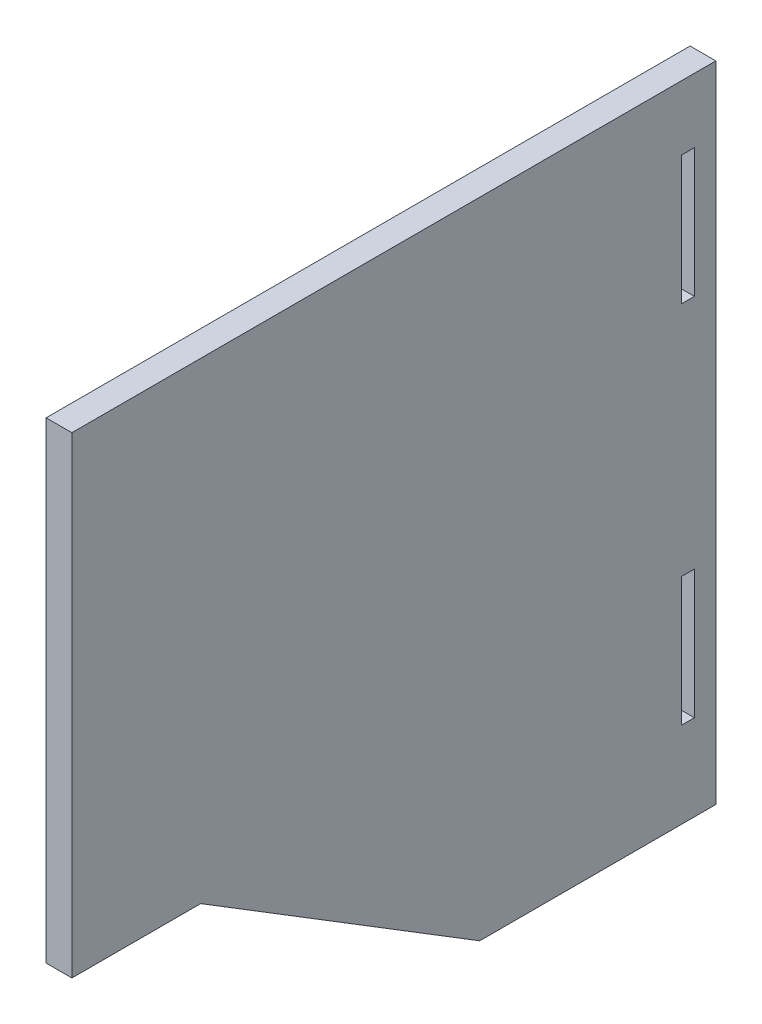
ISO-10303-21;
HEADER;
FILE_DESCRIPTION(('STEP AP214'),'2;1');
FILE_NAME('part.step','',(''),(''),'','','');
FILE_SCHEMA(('AUTOMOTIVE_DESIGN { 1 0 10303 214 1 1 1 1 }'));
ENDSEC;
DATA;
#1=APPLICATION_CONTEXT('core data for automotive mechanical design processes');
#2=APPLICATION_PROTOCOL_DEFINITION('international standard','automotive_design',2000,#1);
#3=PRODUCT_CONTEXT('',#1,'mechanical');
#4=PRODUCT('Part','Part','',(#3));
#5=PRODUCT_RELATED_PRODUCT_CATEGORY('part','',(#4));
#6=PRODUCT_DEFINITION_FORMATION('','',#4);
#7=PRODUCT_DEFINITION_CONTEXT('part definition',#1,'design');
#8=PRODUCT_DEFINITION('design','',#6,#7);
#9=PRODUCT_DEFINITION_SHAPE('','',#8);
#10=(LENGTH_UNIT() NAMED_UNIT(*) SI_UNIT(.MILLI.,.METRE.));
#11=(NAMED_UNIT(*) PLANE_ANGLE_UNIT() SI_UNIT($,.RADIAN.));
#12=(NAMED_UNIT(*) SI_UNIT($,.STERADIAN.) SOLID_ANGLE_UNIT());
#13=UNCERTAINTY_MEASURE_WITH_UNIT(LENGTH_MEASURE(1.E-05),#10,'distance_accuracy_value','');
#14=(GEOMETRIC_REPRESENTATION_CONTEXT(3) GLOBAL_UNCERTAINTY_ASSIGNED_CONTEXT((#13)) GLOBAL_UNIT_ASSIGNED_CONTEXT((#10,
#11,#12)) REPRESENTATION_CONTEXT('',''));
#15=CARTESIAN_POINT('',(0.,0.,0.));
#16=DIRECTION('',(0.,0.,1.));
#17=DIRECTION('',(1.,0.,0.));
#18=AXIS2_PLACEMENT_3D('',#15,#16,#17);
#19=CARTESIAN_POINT('',(-50.,150.,-70.));
#20=DIRECTION('',(0.,0.,1.));
#21=DIRECTION('',(1.,0.,0.));
#22=AXIS2_PLACEMENT_3D('',#19,#20,#21);
#23=PLANE('',#22);
#24=DIRECTION('',(0.,-1.,0.));
#25=VECTOR('',#24,1.);
#26=CARTESIAN_POINT('',(-45.,150.,-70.));
#27=LINE('',#26,#25);
#28=CARTESIAN_POINT('',(-45.,135.,-70.));
#29=VERTEX_POINT('',#28);
#30=CARTESIAN_POINT('',(-45.,105.,-70.));
#31=VERTEX_POINT('',#30);
#32=EDGE_CURVE('E258',#29,#31,#27,.T.);
#33=ORIENTED_EDGE('',*,*,#32,.F.);
#34=DIRECTION('',(1.,0.,0.));
#35=VECTOR('',#34,1.);
#36=CARTESIAN_POINT('',(-51.,135.,-70.));
#37=LINE('',#36,#35);
#38=CARTESIAN_POINT('',(-51.,135.,-70.));
#39=VERTEX_POINT('',#38);
#40=EDGE_CURVE('E236',#39,#29,#37,.T.);
#41=ORIENTED_EDGE('',*,*,#40,.F.);
#42=DIRECTION('',(0.,1.,0.));
#43=VECTOR('',#42,1.);
#44=CARTESIAN_POINT('',(-51.,135.,-70.));
#45=LINE('',#44,#43);
#46=CARTESIAN_POINT('',(-51.,105.,-70.));
#47=VERTEX_POINT('',#46);
#48=EDGE_CURVE('E225',#47,#39,#45,.T.);
#49=ORIENTED_EDGE('',*,*,#48,.F.);
#50=DIRECTION('',(1.,0.,0.));
#51=VECTOR('',#50,1.);
#52=CARTESIAN_POINT('',(-51.,105.,-70.));
#53=LINE('',#52,#51);
#54=EDGE_CURVE('E212',#47,#31,#53,.T.);
#55=ORIENTED_EDGE('',*,*,#54,.T.);
#56=EDGE_LOOP('',(#33,#41,#49,#55));
#57=FACE_BOUND('',#56,.T.);
#58=ADVANCED_FACE('F39',(#57),#23,.T.);
#59=CARTESIAN_POINT('',(-50.,150.,-75.));
#60=DIRECTION('',(0.,0.,1.));
#61=DIRECTION('',(1.,0.,0.));
#62=AXIS2_PLACEMENT_3D('',#59,#60,#61);
#63=PLANE('',#62);
#64=DIRECTION('',(-1.,0.,0.));
#65=VECTOR('',#64,1.);
#66=CARTESIAN_POINT('',(-50.,150.,-75.));
#67=LINE('',#66,#65);
#68=CARTESIAN_POINT('',(-45.,150.,-75.));
#69=VERTEX_POINT('',#68);
#70=CARTESIAN_POINT('',(-51.,150.,-75.));
#71=VERTEX_POINT('',#70);
#72=EDGE_CURVE('E48',#69,#71,#67,.T.);
#73=ORIENTED_EDGE('',*,*,#72,.F.);
#74=DIRECTION('',(0.,1.,0.));
#75=VECTOR('',#74,1.);
#76=CARTESIAN_POINT('',(-45.,0.,-75.));
#77=LINE('',#76,#75);
#78=CARTESIAN_POINT('',(-45.,0.,-75.));
#79=VERTEX_POINT('',#78);
#80=EDGE_CURVE('E146',#79,#69,#77,.T.);
#81=ORIENTED_EDGE('',*,*,#80,.F.);
#82=DIRECTION('',(-1.,0.,0.));
#83=VECTOR('',#82,1.);
#84=CARTESIAN_POINT('',(-50.,0.,-75.));
#85=LINE('',#84,#83);
#86=CARTESIAN_POINT('',(-51.,0.,-75.));
#87=VERTEX_POINT('',#86);
#88=EDGE_CURVE('E43',#79,#87,#85,.T.);
#89=ORIENTED_EDGE('',*,*,#88,.T.);
#90=DIRECTION('',(0.,-1.,0.));
#91=VECTOR('',#90,1.);
#92=CARTESIAN_POINT('',(-51.,150.,-75.));
#93=LINE('',#92,#91);
#94=EDGE_CURVE('E196',#71,#87,#93,.T.);
#95=ORIENTED_EDGE('',*,*,#94,.F.);
#96=EDGE_LOOP('',(#73,#81,#89,#95));
#97=FACE_BOUND('',#96,.T.);
#98=ADVANCED_FACE('F41',(#97),#63,.F.);
#99=CARTESIAN_POINT('',(-45.,150.,75.));
#100=DIRECTION('',(1.,0.,0.));
#101=DIRECTION('',(0.,0.,-1.));
#102=AXIS2_PLACEMENT_3D('',#99,#100,#101);
#103=PLANE('',#102);
#104=DIRECTION('',(0.,0.,1.));
#105=VECTOR('',#104,1.);
#106=CARTESIAN_POINT('',(-45.,135.,75.));
#107=LINE('',#106,#105);
#108=CARTESIAN_POINT('',(-45.,135.,-67.));
#109=VERTEX_POINT('',#108);
#110=EDGE_CURVE('E203',#29,#109,#107,.T.);
#111=ORIENTED_EDGE('',*,*,#110,.F.);
#112=ORIENTED_EDGE('',*,*,#32,.T.);
#113=DIRECTION('',(0.,0.,-1.));
#114=VECTOR('',#113,1.);
#115=CARTESIAN_POINT('',(-45.,105.,75.));
#116=LINE('',#115,#114);
#117=CARTESIAN_POINT('',(-45.,105.,-67.));
#118=VERTEX_POINT('',#117);
#119=EDGE_CURVE('E198',#118,#31,#116,.T.);
#120=ORIENTED_EDGE('',*,*,#119,.F.);
#121=DIRECTION('',(0.,-1.,0.));
#122=VECTOR('',#121,1.);
#123=CARTESIAN_POINT('',(-45.,150.,-67.));
#124=LINE('',#123,#122);
#125=EDGE_CURVE('E201',#109,#118,#124,.T.);
#126=ORIENTED_EDGE('',*,*,#125,.F.);
#127=EDGE_LOOP('',(#111,#112,#120,#126));
#128=FACE_BOUND('',#127,.T.);
#129=DIRECTION('',(0.,0.,1.));
#130=VECTOR('',#129,1.);
#131=CARTESIAN_POINT('',(-45.,50.,75.));
#132=LINE('',#131,#130);
#133=CARTESIAN_POINT('',(-45.,50.,-70.));
#134=VERTEX_POINT('',#133);
#135=CARTESIAN_POINT('',(-45.,50.,-67.));
#136=VERTEX_POINT('',#135);
#137=EDGE_CURVE('E210',#134,#136,#132,.T.);
#138=ORIENTED_EDGE('',*,*,#137,.F.);
#139=CARTESIAN_POINT('',(-45.,20.,-70.));
#140=VERTEX_POINT('',#139);
#141=EDGE_CURVE('E158',#134,#140,#27,.T.);
#142=ORIENTED_EDGE('',*,*,#141,.T.);
#143=DIRECTION('',(0.,0.,-1.));
#144=VECTOR('',#143,1.);
#145=CARTESIAN_POINT('',(-45.,20.0000000000003,75.0000000000003));
#146=LINE('',#145,#144);
#147=CARTESIAN_POINT('',(-45.,20.,-67.));
#148=VERTEX_POINT('',#147);
#149=EDGE_CURVE('E205',#148,#140,#146,.T.);
#150=ORIENTED_EDGE('',*,*,#149,.F.);
#151=DIRECTION('',(0.,-1.,0.));
#152=VECTOR('',#151,1.);
#153=CARTESIAN_POINT('',(-45.,150.,-67.));
#154=LINE('',#153,#152);
#155=EDGE_CURVE('E208',#136,#148,#154,.T.);
#156=ORIENTED_EDGE('',*,*,#155,.F.);
#157=EDGE_LOOP('',(#138,#142,#150,#156));
#158=FACE_BOUND('',#157,.T.);
#159=DIRECTION('',(0.,0.,1.));
#160=VECTOR('',#159,1.);
#161=CARTESIAN_POINT('',(-45.,150.,0.));
#162=LINE('',#161,#160);
#163=CARTESIAN_POINT('',(-45.,150.,75.));
#164=VERTEX_POINT('',#163);
#165=EDGE_CURVE('E176',#69,#164,#162,.T.);
#166=ORIENTED_EDGE('',*,*,#165,.T.);
#167=DIRECTION('',(0.,1.,0.));
#168=VECTOR('',#167,1.);
#169=CARTESIAN_POINT('',(-45.,0.,75.));
#170=LINE('',#169,#168);
#171=CARTESIAN_POINT('',(-45.,40.,75.));
#172=VERTEX_POINT('',#171);
#173=EDGE_CURVE('E153',#172,#164,#170,.T.);
#174=ORIENTED_EDGE('',*,*,#173,.F.);
#175=DIRECTION('',(0.,0.,1.));
#176=VECTOR('',#175,1.);
#177=CARTESIAN_POINT('',(-45.,40.,75.));
#178=LINE('',#177,#176);
#179=CARTESIAN_POINT('',(-45.,40.,45.));
#180=VERTEX_POINT('',#179);
#181=EDGE_CURVE('E235',#180,#172,#178,.T.);
#182=ORIENTED_EDGE('',*,*,#181,.F.);
#183=DIRECTION('',(0.,0.524097425664335,0.851658316704544));
#184=VECTOR('',#183,1.);
#185=CARTESIAN_POINT('',(-45.,40.,45.));
#186=LINE('',#185,#184);
#187=CARTESIAN_POINT('',(-45.,0.,-20.));
#188=VERTEX_POINT('',#187);
#189=EDGE_CURVE('E149',#188,#180,#186,.T.);
#190=ORIENTED_EDGE('',*,*,#189,.F.);
#191=DIRECTION('',(0.,0.,1.));
#192=VECTOR('',#191,1.);
#193=CARTESIAN_POINT('',(-45.,0.,-75.));
#194=LINE('',#193,#192);
#195=EDGE_CURVE('E143',#79,#188,#194,.T.);
#196=ORIENTED_EDGE('',*,*,#195,.F.);
#197=ORIENTED_EDGE('',*,*,#80,.T.);
#198=EDGE_LOOP('',(#166,#174,#182,#190,#196,#197));
#199=FACE_BOUND('',#198,.T.);
#200=ADVANCED_FACE('F145',(#128,#158,#199),#103,.T.);
#201=CARTESIAN_POINT('',(0.,150.,0.));
#202=DIRECTION('',(0.,-1.,0.));
#203=DIRECTION('',(0.,0.,-1.));
#204=AXIS2_PLACEMENT_3D('',#201,#202,#203);
#205=PLANE('',#204);
#206=DIRECTION('',(1.,0.,0.));
#207=VECTOR('',#206,1.);
#208=CARTESIAN_POINT('',(-50.,150.,75.));
#209=LINE('',#208,#207);
#210=CARTESIAN_POINT('',(-51.,150.,75.));
#211=VERTEX_POINT('',#210);
#212=EDGE_CURVE('E11',#211,#164,#209,.T.);
#213=ORIENTED_EDGE('',*,*,#212,.T.);
#214=ORIENTED_EDGE('',*,*,#165,.F.);
#215=ORIENTED_EDGE('',*,*,#72,.T.);
#216=DIRECTION('',(0.,0.,-1.));
#217=VECTOR('',#216,1.);
#218=CARTESIAN_POINT('',(-51.,150.,-75.));
#219=LINE('',#218,#217);
#220=EDGE_CURVE('E181',#211,#71,#219,.T.);
#221=ORIENTED_EDGE('',*,*,#220,.F.);
#222=EDGE_LOOP('',(#213,#214,#215,#221));
#223=FACE_BOUND('',#222,.T.);
#224=ADVANCED_FACE('F262',(#223),#205,.F.);
#225=CARTESIAN_POINT('',(-50.,150.,75.));
#226=DIRECTION('',(0.,0.,-1.));
#227=DIRECTION('',(-1.,0.,0.));
#228=AXIS2_PLACEMENT_3D('',#225,#226,#227);
#229=PLANE('',#228);
#230=DIRECTION('',(1.,0.,0.));
#231=VECTOR('',#230,1.);
#232=CARTESIAN_POINT('',(-50.001,40.,75.));
#233=LINE('',#232,#231);
#234=CARTESIAN_POINT('',(-51.,40.,75.));
#235=VERTEX_POINT('',#234);
#236=EDGE_CURVE('E164',#235,#172,#233,.T.);
#237=ORIENTED_EDGE('',*,*,#236,.T.);
#238=ORIENTED_EDGE('',*,*,#173,.T.);
#239=ORIENTED_EDGE('',*,*,#212,.F.);
#240=DIRECTION('',(0.,1.,0.));
#241=VECTOR('',#240,1.);
#242=CARTESIAN_POINT('',(-51.,150.,75.));
#243=LINE('',#242,#241);
#244=EDGE_CURVE('E183',#235,#211,#243,.T.);
#245=ORIENTED_EDGE('',*,*,#244,.F.);
#246=EDGE_LOOP('',(#237,#238,#239,#245));
#247=FACE_BOUND('',#246,.T.);
#248=ADVANCED_FACE('F260',(#247),#229,.F.);
#249=CARTESIAN_POINT('',(0.,0.,0.));
#250=DIRECTION('',(0.,-1.,0.));
#251=DIRECTION('',(0.,0.,-1.));
#252=AXIS2_PLACEMENT_3D('',#249,#250,#251);
#253=PLANE('',#252);
#254=ORIENTED_EDGE('',*,*,#195,.T.);
#255=DIRECTION('',(1.,0.,0.));
#256=VECTOR('',#255,1.);
#257=CARTESIAN_POINT('',(-50.001,0.,-20.));
#258=LINE('',#257,#256);
#259=CARTESIAN_POINT('',(-51.,0.,-20.));
#260=VERTEX_POINT('',#259);
#261=EDGE_CURVE('E173',#260,#188,#258,.T.);
#262=ORIENTED_EDGE('',*,*,#261,.F.);
#263=DIRECTION('',(0.,0.,1.));
#264=VECTOR('',#263,1.);
#265=CARTESIAN_POINT('',(-51.,0.,-20.));
#266=LINE('',#265,#264);
#267=EDGE_CURVE('E162',#87,#260,#266,.T.);
#268=ORIENTED_EDGE('',*,*,#267,.F.);
#269=ORIENTED_EDGE('',*,*,#88,.F.);
#270=EDGE_LOOP('',(#254,#262,#268,#269));
#271=FACE_BOUND('',#270,.T.);
#272=ADVANCED_FACE('F160',(#271),#253,.T.);
#273=CARTESIAN_POINT('',(-50.001,40.,75.));
#274=DIRECTION('',(0.,1.,0.));
#275=DIRECTION('',(0.,0.,1.));
#276=AXIS2_PLACEMENT_3D('',#273,#274,#275);
#277=PLANE('',#276);
#278=DIRECTION('',(1.,0.,0.));
#279=VECTOR('',#278,1.);
#280=CARTESIAN_POINT('',(-50.001,40.,45.));
#281=LINE('',#280,#279);
#282=CARTESIAN_POINT('',(-51.,40.,45.));
#283=VERTEX_POINT('',#282);
#284=EDGE_CURVE('E167',#283,#180,#281,.T.);
#285=ORIENTED_EDGE('',*,*,#284,.T.);
#286=ORIENTED_EDGE('',*,*,#181,.T.);
#287=ORIENTED_EDGE('',*,*,#236,.F.);
#288=DIRECTION('',(0.,0.,1.));
#289=VECTOR('',#288,1.);
#290=CARTESIAN_POINT('',(-51.,40.,75.));
#291=LINE('',#290,#289);
#292=EDGE_CURVE('E187',#283,#235,#291,.T.);
#293=ORIENTED_EDGE('',*,*,#292,.F.);
#294=EDGE_LOOP('',(#285,#286,#287,#293));
#295=FACE_BOUND('',#294,.T.);
#296=ADVANCED_FACE('F291',(#295),#277,.F.);
#297=CARTESIAN_POINT('',(-50.001,40.,45.));
#298=DIRECTION('',(0.,0.851658316704544,-0.524097425664335));
#299=DIRECTION('',(0.,0.524097425664335,0.851658316704544));
#300=AXIS2_PLACEMENT_3D('',#297,#298,#299);
#301=PLANE('',#300);
#302=ORIENTED_EDGE('',*,*,#261,.T.);
#303=ORIENTED_EDGE('',*,*,#189,.T.);
#304=ORIENTED_EDGE('',*,*,#284,.F.);
#305=DIRECTION('',(0.,0.524097425664335,0.851658316704544));
#306=VECTOR('',#305,1.);
#307=CARTESIAN_POINT('',(-51.,40.,45.));
#308=LINE('',#307,#306);
#309=EDGE_CURVE('E192',#260,#283,#308,.T.);
#310=ORIENTED_EDGE('',*,*,#309,.F.);
#311=EDGE_LOOP('',(#302,#303,#304,#310));
#312=FACE_BOUND('',#311,.T.);
#313=ADVANCED_FACE('F283',(#312),#301,.F.);
#314=ORIENTED_EDGE('',*,*,#141,.F.);
#315=DIRECTION('',(1.,0.,0.));
#316=VECTOR('',#315,1.);
#317=CARTESIAN_POINT('',(-51.,50.,-70.));
#318=LINE('',#317,#316);
#319=CARTESIAN_POINT('',(-51.,50.,-70.));
#320=VERTEX_POINT('',#319);
#321=EDGE_CURVE('E213',#320,#134,#318,.T.);
#322=ORIENTED_EDGE('',*,*,#321,.F.);
#323=DIRECTION('',(0.,1.,0.));
#324=VECTOR('',#323,1.);
#325=CARTESIAN_POINT('',(-51.,20.,-70.));
#326=LINE('',#325,#324);
#327=CARTESIAN_POINT('',(-51.,20.,-70.));
#328=VERTEX_POINT('',#327);
#329=EDGE_CURVE('E232',#328,#320,#326,.T.);
#330=ORIENTED_EDGE('',*,*,#329,.F.);
#331=DIRECTION('',(1.,0.,0.));
#332=VECTOR('',#331,1.);
#333=CARTESIAN_POINT('',(-51.,20.,-70.));
#334=LINE('',#333,#332);
#335=EDGE_CURVE('E222',#328,#140,#334,.T.);
#336=ORIENTED_EDGE('',*,*,#335,.T.);
#337=EDGE_LOOP('',(#314,#322,#330,#336));
#338=FACE_BOUND('',#337,.T.);
#339=ADVANCED_FACE('F276',(#338),#23,.T.);
#340=CARTESIAN_POINT('',(-51.,0.,0.));
#341=DIRECTION('',(1.,0.,0.));
#342=DIRECTION('',(0.,0.,-1.));
#343=AXIS2_PLACEMENT_3D('',#340,#341,#342);
#344=PLANE('',#343);
#345=DIRECTION('',(0.,0.,-1.));
#346=VECTOR('',#345,1.);
#347=CARTESIAN_POINT('',(-51.,105.,-70.));
#348=LINE('',#347,#346);
#349=CARTESIAN_POINT('',(-51.,105.,-67.));
#350=VERTEX_POINT('',#349);
#351=EDGE_CURVE('E240',#350,#47,#348,.T.);
#352=ORIENTED_EDGE('',*,*,#351,.T.);
#353=ORIENTED_EDGE('',*,*,#48,.T.);
#354=DIRECTION('',(0.,0.,1.));
#355=VECTOR('',#354,1.);
#356=CARTESIAN_POINT('',(-51.,135.,-70.));
#357=LINE('',#356,#355);
#358=CARTESIAN_POINT('',(-51.,135.,-67.));
#359=VERTEX_POINT('',#358);
#360=EDGE_CURVE('E250',#39,#359,#357,.T.);
#361=ORIENTED_EDGE('',*,*,#360,.T.);
#362=DIRECTION('',(0.,-1.,0.));
#363=VECTOR('',#362,1.);
#364=CARTESIAN_POINT('',(-51.,135.,-67.));
#365=LINE('',#364,#363);
#366=EDGE_CURVE('E55',#359,#350,#365,.T.);
#367=ORIENTED_EDGE('',*,*,#366,.T.);
#368=EDGE_LOOP('',(#352,#353,#361,#367));
#369=FACE_BOUND('',#368,.T.);
#370=DIRECTION('',(0.,0.,-1.));
#371=VECTOR('',#370,1.);
#372=CARTESIAN_POINT('',(-51.,20.,-70.));
#373=LINE('',#372,#371);
#374=CARTESIAN_POINT('',(-51.,20.,-67.));
#375=VERTEX_POINT('',#374);
#376=EDGE_CURVE('E217',#375,#328,#373,.T.);
#377=ORIENTED_EDGE('',*,*,#376,.T.);
#378=ORIENTED_EDGE('',*,*,#329,.T.);
#379=DIRECTION('',(0.,0.,1.));
#380=VECTOR('',#379,1.);
#381=CARTESIAN_POINT('',(-51.,50.,-70.));
#382=LINE('',#381,#380);
#383=CARTESIAN_POINT('',(-51.,50.,-67.));
#384=VERTEX_POINT('',#383);
#385=EDGE_CURVE('E229',#320,#384,#382,.T.);
#386=ORIENTED_EDGE('',*,*,#385,.T.);
#387=DIRECTION('',(0.,-1.,0.));
#388=VECTOR('',#387,1.);
#389=CARTESIAN_POINT('',(-51.,20.,-67.));
#390=LINE('',#389,#388);
#391=EDGE_CURVE('E63',#384,#375,#390,.T.);
#392=ORIENTED_EDGE('',*,*,#391,.T.);
#393=EDGE_LOOP('',(#377,#378,#386,#392));
#394=FACE_BOUND('',#393,.T.);
#395=ORIENTED_EDGE('',*,*,#94,.T.);
#396=ORIENTED_EDGE('',*,*,#267,.T.);
#397=ORIENTED_EDGE('',*,*,#309,.T.);
#398=ORIENTED_EDGE('',*,*,#292,.T.);
#399=ORIENTED_EDGE('',*,*,#244,.T.);
#400=ORIENTED_EDGE('',*,*,#220,.T.);
#401=EDGE_LOOP('',(#395,#396,#397,#398,#399,#400));
#402=FACE_BOUND('',#401,.T.);
#403=ADVANCED_FACE('F282',(#369,#394,#402),#344,.F.);
#404=CARTESIAN_POINT('',(-51.,50.,-70.));
#405=DIRECTION('',(0.,1.,0.));
#406=DIRECTION('',(0.,0.,1.));
#407=AXIS2_PLACEMENT_3D('',#404,#405,#406);
#408=PLANE('',#407);
#409=ORIENTED_EDGE('',*,*,#137,.T.);
#410=DIRECTION('',(1.,0.,0.));
#411=VECTOR('',#410,1.);
#412=CARTESIAN_POINT('',(-51.,50.,-67.));
#413=LINE('',#412,#411);
#414=EDGE_CURVE('E216',#384,#136,#413,.T.);
#415=ORIENTED_EDGE('',*,*,#414,.F.);
#416=ORIENTED_EDGE('',*,*,#385,.F.);
#417=ORIENTED_EDGE('',*,*,#321,.T.);
#418=EDGE_LOOP('',(#409,#415,#416,#417));
#419=FACE_BOUND('',#418,.T.);
#420=ADVANCED_FACE('F289',(#419),#408,.F.);
#421=CARTESIAN_POINT('',(-51.,20.,-67.));
#422=DIRECTION('',(0.,0.,1.));
#423=DIRECTION('',(0.,-1.,0.));
#424=AXIS2_PLACEMENT_3D('',#421,#422,#423);
#425=PLANE('',#424);
#426=ORIENTED_EDGE('',*,*,#155,.T.);
#427=DIRECTION('',(1.,0.,0.));
#428=VECTOR('',#427,1.);
#429=CARTESIAN_POINT('',(-51.,20.,-67.));
#430=LINE('',#429,#428);
#431=EDGE_CURVE('E219',#375,#148,#430,.T.);
#432=ORIENTED_EDGE('',*,*,#431,.F.);
#433=ORIENTED_EDGE('',*,*,#391,.F.);
#434=ORIENTED_EDGE('',*,*,#414,.T.);
#435=EDGE_LOOP('',(#426,#432,#433,#434));
#436=FACE_BOUND('',#435,.T.);
#437=ADVANCED_FACE('F299',(#436),#425,.F.);
#438=CARTESIAN_POINT('',(-51.,20.,-70.));
#439=DIRECTION('',(0.,-1.,0.));
#440=DIRECTION('',(0.,0.,-1.));
#441=AXIS2_PLACEMENT_3D('',#438,#439,#440);
#442=PLANE('',#441);
#443=ORIENTED_EDGE('',*,*,#149,.T.);
#444=ORIENTED_EDGE('',*,*,#335,.F.);
#445=ORIENTED_EDGE('',*,*,#376,.F.);
#446=ORIENTED_EDGE('',*,*,#431,.T.);
#447=EDGE_LOOP('',(#443,#444,#445,#446));
#448=FACE_BOUND('',#447,.T.);
#449=ADVANCED_FACE('F302',(#448),#442,.F.);
#450=CARTESIAN_POINT('',(-51.,135.,-70.));
#451=DIRECTION('',(0.,1.,0.));
#452=DIRECTION('',(0.,0.,1.));
#453=AXIS2_PLACEMENT_3D('',#450,#451,#452);
#454=PLANE('',#453);
#455=ORIENTED_EDGE('',*,*,#110,.T.);
#456=DIRECTION('',(1.,0.,0.));
#457=VECTOR('',#456,1.);
#458=CARTESIAN_POINT('',(-51.,135.,-67.));
#459=LINE('',#458,#457);
#460=EDGE_CURVE('E239',#359,#109,#459,.T.);
#461=ORIENTED_EDGE('',*,*,#460,.F.);
#462=ORIENTED_EDGE('',*,*,#360,.F.);
#463=ORIENTED_EDGE('',*,*,#40,.T.);
#464=EDGE_LOOP('',(#455,#461,#462,#463));
#465=FACE_BOUND('',#464,.T.);
#466=ADVANCED_FACE('F353',(#465),#454,.F.);
#467=CARTESIAN_POINT('',(-51.,135.,-67.));
#468=DIRECTION('',(0.,0.,1.));
#469=DIRECTION('',(1.,0.,0.));
#470=AXIS2_PLACEMENT_3D('',#467,#468,#469);
#471=PLANE('',#470);
#472=ORIENTED_EDGE('',*,*,#125,.T.);
#473=DIRECTION('',(1.,0.,0.));
#474=VECTOR('',#473,1.);
#475=CARTESIAN_POINT('',(-51.,105.,-67.));
#476=LINE('',#475,#474);
#477=EDGE_CURVE('E242',#350,#118,#476,.T.);
#478=ORIENTED_EDGE('',*,*,#477,.F.);
#479=ORIENTED_EDGE('',*,*,#366,.F.);
#480=ORIENTED_EDGE('',*,*,#460,.T.);
#481=EDGE_LOOP('',(#472,#478,#479,#480));
#482=FACE_BOUND('',#481,.T.);
#483=ADVANCED_FACE('F347',(#482),#471,.F.);
#484=CARTESIAN_POINT('',(-51.,105.,-70.));
#485=DIRECTION('',(0.,-1.,0.));
#486=DIRECTION('',(0.,0.,-1.));
#487=AXIS2_PLACEMENT_3D('',#484,#485,#486);
#488=PLANE('',#487);
#489=ORIENTED_EDGE('',*,*,#119,.T.);
#490=ORIENTED_EDGE('',*,*,#54,.F.);
#491=ORIENTED_EDGE('',*,*,#351,.F.);
#492=ORIENTED_EDGE('',*,*,#477,.T.);
#493=EDGE_LOOP('',(#489,#490,#491,#492));
#494=FACE_BOUND('',#493,.T.);
#495=ADVANCED_FACE('F352',(#494),#488,.F.);
#496=CLOSED_SHELL('',(#58,#98,#200,#224,#248,#272,#296,#313,#339,#403,#420,#437,#449,#466,#483,#495));
#497=MANIFOLD_SOLID_BREP('B2',#496);
#498=ADVANCED_BREP_SHAPE_REPRESENTATION('',(#18,#497),#14);
#499=SHAPE_DEFINITION_REPRESENTATION(#9,#498);
ENDSEC;
END-ISO-10303-21;
